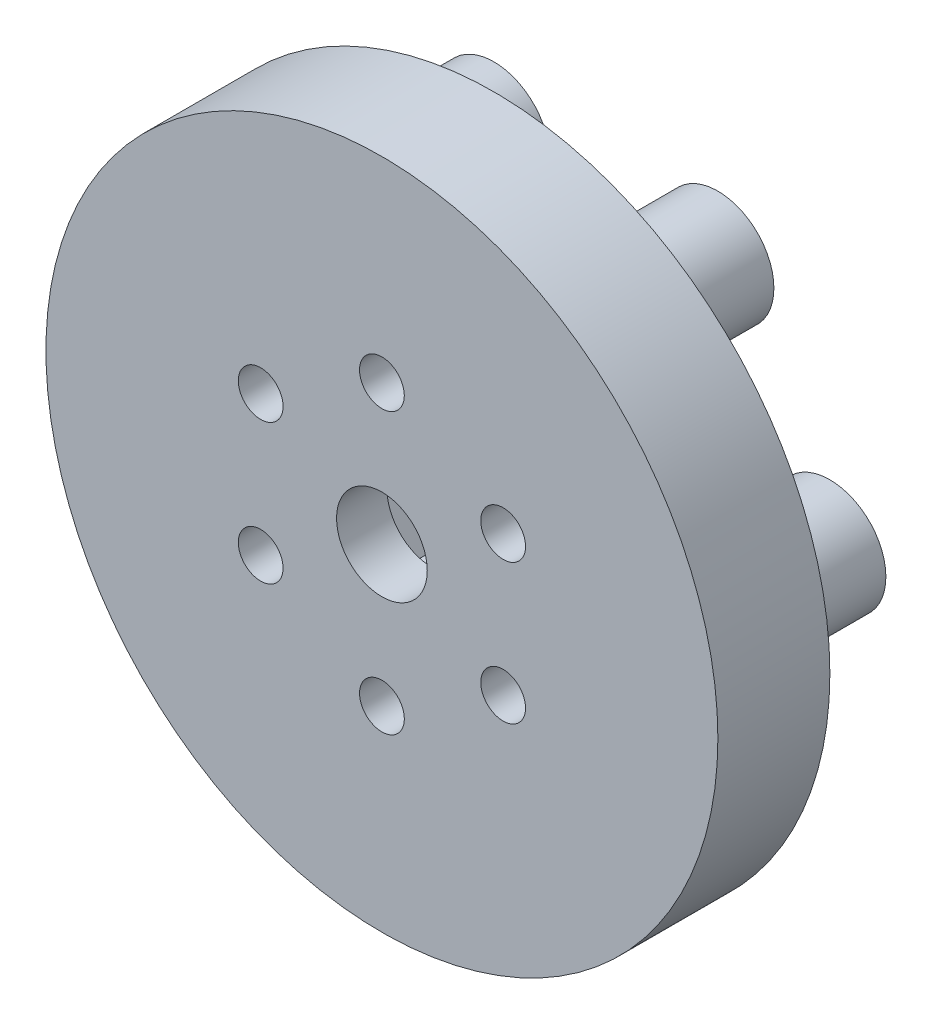
ISO-10303-21;
HEADER;
FILE_DESCRIPTION(('STEP AP214'),'2;1');
FILE_NAME('part.step','',(''),(''),'','','');
FILE_SCHEMA(('AUTOMOTIVE_DESIGN { 1 0 10303 214 1 1 1 1 }'));
ENDSEC;
DATA;
#1=APPLICATION_CONTEXT('core data for automotive mechanical design processes');
#2=APPLICATION_PROTOCOL_DEFINITION('international standard','automotive_design',2000,#1);
#3=PRODUCT_CONTEXT('',#1,'mechanical');
#4=PRODUCT('Part','Part','',(#3));
#5=PRODUCT_RELATED_PRODUCT_CATEGORY('part','',(#4));
#6=PRODUCT_DEFINITION_FORMATION('','',#4);
#7=PRODUCT_DEFINITION_CONTEXT('part definition',#1,'design');
#8=PRODUCT_DEFINITION('design','',#6,#7);
#9=PRODUCT_DEFINITION_SHAPE('','',#8);
#10=(LENGTH_UNIT() NAMED_UNIT(*) SI_UNIT(.MILLI.,.METRE.));
#11=(NAMED_UNIT(*) PLANE_ANGLE_UNIT() SI_UNIT($,.RADIAN.));
#12=(NAMED_UNIT(*) SI_UNIT($,.STERADIAN.) SOLID_ANGLE_UNIT());
#13=UNCERTAINTY_MEASURE_WITH_UNIT(LENGTH_MEASURE(1.E-05),#10,'distance_accuracy_value','');
#14=(GEOMETRIC_REPRESENTATION_CONTEXT(3) GLOBAL_UNCERTAINTY_ASSIGNED_CONTEXT((#13)) GLOBAL_UNIT_ASSIGNED_CONTEXT((#10,
#11,#12)) REPRESENTATION_CONTEXT('',''));
#15=CARTESIAN_POINT('',(0.,0.,0.));
#16=DIRECTION('',(0.,0.,1.));
#17=DIRECTION('',(1.,0.,0.));
#18=AXIS2_PLACEMENT_3D('',#15,#16,#17);
#19=CARTESIAN_POINT('',(0.,0.,20.));
#20=DIRECTION('',(0.,0.,-1.));
#21=DIRECTION('',(-1.,0.,0.));
#22=AXIS2_PLACEMENT_3D('',#19,#20,#21);
#23=CYLINDRICAL_SURFACE('',#22,4.05);
#24=CARTESIAN_POINT('',(0.,0.,20.));
#25=DIRECTION('',(0.,0.,1.));
#26=DIRECTION('',(1.,0.,0.));
#27=AXIS2_PLACEMENT_3D('',#24,#25,#26);
#28=CIRCLE('',#27,4.05);
#29=CARTESIAN_POINT('',(4.05,0.,20.));
#30=VERTEX_POINT('',#29);
#31=EDGE_CURVE('E190',#30,#30,#28,.T.);
#32=ORIENTED_EDGE('',*,*,#31,.T.);
#33=EDGE_LOOP('',(#32));
#34=FACE_BOUND('',#33,.T.);
#35=CARTESIAN_POINT('',(0.,0.,15.5));
#36=DIRECTION('',(0.,0.,-1.));
#37=DIRECTION('',(-1.,0.,0.));
#38=AXIS2_PLACEMENT_3D('',#35,#36,#37);
#39=CIRCLE('',#38,4.05);
#40=CARTESIAN_POINT('',(-4.05,0.,15.5));
#41=VERTEX_POINT('',#40);
#42=EDGE_CURVE('E37',#41,#41,#39,.T.);
#43=ORIENTED_EDGE('',*,*,#42,.T.);
#44=EDGE_LOOP('',(#43));
#45=FACE_BOUND('',#44,.T.);
#46=ADVANCED_FACE('F33',(#34,#45),#23,.F.);
#47=CARTESIAN_POINT('',(20.,0.,10.));
#48=DIRECTION('',(0.,0.,-1.));
#49=DIRECTION('',(-1.,0.,0.));
#50=AXIS2_PLACEMENT_3D('',#47,#48,#49);
#51=CYLINDRICAL_SURFACE('',#50,5.);
#52=CARTESIAN_POINT('',(20.,0.,10.));
#53=DIRECTION('',(0.,0.,1.));
#54=DIRECTION('',(1.,0.,0.));
#55=AXIS2_PLACEMENT_3D('',#52,#53,#54);
#56=CIRCLE('',#55,5.);
#57=CARTESIAN_POINT('',(25.,0.,10.));
#58=VERTEX_POINT('',#57);
#59=EDGE_CURVE('E202',#58,#58,#56,.T.);
#60=ORIENTED_EDGE('',*,*,#59,.F.);
#61=EDGE_LOOP('',(#60));
#62=FACE_BOUND('',#61,.T.);
#63=CARTESIAN_POINT('',(20.,0.,0.));
#64=DIRECTION('',(0.,0.,1.));
#65=DIRECTION('',(1.,0.,0.));
#66=AXIS2_PLACEMENT_3D('',#63,#64,#65);
#67=CIRCLE('',#66,5.);
#68=CARTESIAN_POINT('',(25.,0.,0.));
#69=VERTEX_POINT('',#68);
#70=EDGE_CURVE('E199',#69,#69,#67,.T.);
#71=ORIENTED_EDGE('',*,*,#70,.T.);
#72=EDGE_LOOP('',(#71));
#73=FACE_BOUND('',#72,.T.);
#74=ADVANCED_FACE('F35',(#62,#73),#51,.T.);
#75=CARTESIAN_POINT('',(20.,0.,0.));
#76=DIRECTION('',(0.,0.,1.));
#77=DIRECTION('',(1.,0.,0.));
#78=AXIS2_PLACEMENT_3D('',#75,#76,#77);
#79=PLANE('',#78);
#80=ORIENTED_EDGE('',*,*,#70,.F.);
#81=EDGE_LOOP('',(#80));
#82=FACE_BOUND('',#81,.T.);
#83=ADVANCED_FACE('F273',(#82),#79,.F.);
#84=CARTESIAN_POINT('',(0.,0.,20.));
#85=DIRECTION('',(0.,0.,1.));
#86=DIRECTION('',(1.,0.,0.));
#87=AXIS2_PLACEMENT_3D('',#84,#85,#86);
#88=PLANE('',#87);
#89=CARTESIAN_POINT('',(-10.8235409464711,-6.25134508762161,20.));
#90=DIRECTION('',(0.,0.,1.));
#91=DIRECTION('',(1.,0.,0.));
#92=AXIS2_PLACEMENT_3D('',#89,#90,#91);
#93=CIRCLE('',#92,2.);
#94=CARTESIAN_POINT('',(-8.82354094647114,-6.25134508762161,20.));
#95=VERTEX_POINT('',#94);
#96=EDGE_CURVE('E163',#95,#95,#93,.T.);
#97=ORIENTED_EDGE('',*,*,#96,.F.);
#98=EDGE_LOOP('',(#97));
#99=FACE_BOUND('',#98,.T.);
#100=CARTESIAN_POINT('',(10.8270941269389,-6.24865490013805,20.));
#101=DIRECTION('',(0.,0.,1.));
#102=DIRECTION('',(1.,0.,0.));
#103=AXIS2_PLACEMENT_3D('',#100,#101,#102);
#104=CIRCLE('',#103,2.);
#105=CARTESIAN_POINT('',(12.8270941269389,-6.24865490013805,20.));
#106=VERTEX_POINT('',#105);
#107=EDGE_CURVE('E175',#106,#106,#104,.T.);
#108=ORIENTED_EDGE('',*,*,#107,.F.);
#109=EDGE_LOOP('',(#108));
#110=FACE_BOUND('',#109,.T.);
#111=CARTESIAN_POINT('',(-0.000553180467794532,12.4999999877597,20.));
#112=DIRECTION('',(0.,0.,1.));
#113=DIRECTION('',(1.,0.,0.));
#114=AXIS2_PLACEMENT_3D('',#111,#112,#113);
#115=CIRCLE('',#114,2.);
#116=CARTESIAN_POINT('',(1.99944681953221,12.4999999877597,20.));
#117=VERTEX_POINT('',#116);
#118=EDGE_CURVE('E187',#117,#117,#115,.T.);
#119=ORIENTED_EDGE('',*,*,#118,.F.);
#120=EDGE_LOOP('',(#119));
#121=FACE_BOUND('',#120,.T.);
#122=CARTESIAN_POINT('',(0.,0.,20.));
#123=DIRECTION('',(0.,0.,1.));
#124=DIRECTION('',(1.,0.,0.));
#125=AXIS2_PLACEMENT_3D('',#122,#123,#124);
#126=CIRCLE('',#125,30.);
#127=CARTESIAN_POINT('',(30.,0.,20.));
#128=VERTEX_POINT('',#127);
#129=EDGE_CURVE('E196',#128,#128,#126,.T.);
#130=ORIENTED_EDGE('',*,*,#129,.T.);
#131=EDGE_LOOP('',(#130));
#132=FACE_BOUND('',#131,.T.);
#133=ORIENTED_EDGE('',*,*,#31,.F.);
#134=EDGE_LOOP('',(#133));
#135=FACE_BOUND('',#134,.T.);
#136=CARTESIAN_POINT('',(10.8255409464711,6.25134508762161,20.));
#137=DIRECTION('',(0.,0.,1.));
#138=DIRECTION('',(1.,0.,0.));
#139=AXIS2_PLACEMENT_3D('',#136,#137,#138);
#140=CIRCLE('',#139,2.);
#141=CARTESIAN_POINT('',(12.8255409464711,6.25134508762161,20.));
#142=VERTEX_POINT('',#141);
#143=EDGE_CURVE('E181',#142,#142,#140,.T.);
#144=ORIENTED_EDGE('',*,*,#143,.F.);
#145=EDGE_LOOP('',(#144));
#146=FACE_BOUND('',#145,.T.);
#147=CARTESIAN_POINT('',(0.00255318046779606,-12.4999999877597,20.));
#148=DIRECTION('',(0.,0.,1.));
#149=DIRECTION('',(1.,0.,0.));
#150=AXIS2_PLACEMENT_3D('',#147,#148,#149);
#151=CIRCLE('',#150,2.);
#152=CARTESIAN_POINT('',(2.0025531804678,-12.4999999877597,20.));
#153=VERTEX_POINT('',#152);
#154=EDGE_CURVE('E169',#153,#153,#151,.T.);
#155=ORIENTED_EDGE('',*,*,#154,.F.);
#156=EDGE_LOOP('',(#155));
#157=FACE_BOUND('',#156,.T.);
#158=CARTESIAN_POINT('',(-10.8250941269389,6.24865490013805,20.));
#159=DIRECTION('',(0.,0.,1.));
#160=DIRECTION('',(1.,0.,0.));
#161=AXIS2_PLACEMENT_3D('',#158,#159,#160);
#162=CIRCLE('',#161,2.);
#163=CARTESIAN_POINT('',(-8.82509412693894,6.24865490013805,20.));
#164=VERTEX_POINT('',#163);
#165=EDGE_CURVE('E157',#164,#164,#162,.T.);
#166=ORIENTED_EDGE('',*,*,#165,.F.);
#167=EDGE_LOOP('',(#166));
#168=FACE_BOUND('',#167,.T.);
#169=ADVANCED_FACE('F226',(#99,#110,#121,#132,#135,#146,#157,#168),#88,.T.);
#170=CARTESIAN_POINT('',(0.,0.,10.));
#171=DIRECTION('',(0.,0.,1.));
#172=DIRECTION('',(1.,0.,0.));
#173=AXIS2_PLACEMENT_3D('',#170,#171,#172);
#174=PLANE('',#173);
#175=DIRECTION('',(0.501367596211165,0.865234380656154,0.));
#176=VECTOR('',#175,1.);
#177=CARTESIAN_POINT('',(-7.62101404212473,0.0120403379396221,10.));
#178=LINE('',#177,#176);
#179=CARTESIAN_POINT('',(-7.62101404212473,0.0120403379396221,10.));
#180=VERTEX_POINT('',#179);
#181=CARTESIAN_POINT('',(-3.80007978253651,6.60601193204776,10.));
#182=VERTEX_POINT('',#181);
#183=EDGE_CURVE('E123',#180,#182,#178,.T.);
#184=ORIENTED_EDGE('',*,*,#183,.F.);
#185=DIRECTION('',(-0.498631155770342,0.866814265281285,0.));
#186=VECTOR('',#185,1.);
#187=CARTESIAN_POINT('',(-3.82093425958823,-6.59397159410814,10.));
#188=LINE('',#187,#186);
#189=CARTESIAN_POINT('',(-3.82093425958823,-6.59397159410814,10.));
#190=VERTEX_POINT('',#189);
#191=EDGE_CURVE('E49',#190,#180,#188,.T.);
#192=ORIENTED_EDGE('',*,*,#191,.F.);
#193=DIRECTION('',(-0.999998751981507,0.00157988462513009,0.));
#194=VECTOR('',#193,1.);
#195=CARTESIAN_POINT('',(3.8000797825365,-6.60601193204776,10.));
#196=LINE('',#195,#194);
#197=CARTESIAN_POINT('',(3.8000797825365,-6.60601193204776,10.));
#198=VERTEX_POINT('',#197);
#199=EDGE_CURVE('E132',#198,#190,#196,.T.);
#200=ORIENTED_EDGE('',*,*,#199,.F.);
#201=DIRECTION('',(-0.501367596211165,-0.865234380656154,0.));
#202=VECTOR('',#201,1.);
#203=CARTESIAN_POINT('',(7.62101404212473,-0.0120403379396221,10.));
#204=LINE('',#203,#202);
#205=CARTESIAN_POINT('',(7.62101404212473,-0.0120403379396221,10.));
#206=VERTEX_POINT('',#205);
#207=EDGE_CURVE('E130',#206,#198,#204,.T.);
#208=ORIENTED_EDGE('',*,*,#207,.F.);
#209=DIRECTION('',(0.498631155770342,-0.866814265281284,0.));
#210=VECTOR('',#209,1.);
#211=CARTESIAN_POINT('',(3.82093425958822,6.59397159410814,10.));
#212=LINE('',#211,#210);
#213=CARTESIAN_POINT('',(3.82093425958822,6.59397159410814,10.));
#214=VERTEX_POINT('',#213);
#215=EDGE_CURVE('E97',#214,#206,#212,.T.);
#216=ORIENTED_EDGE('',*,*,#215,.F.);
#217=DIRECTION('',(0.999998751981507,-0.00157988462513008,0.));
#218=VECTOR('',#217,1.);
#219=CARTESIAN_POINT('',(-3.80007978253651,6.60601193204776,10.));
#220=LINE('',#219,#218);
#221=EDGE_CURVE('E126',#182,#214,#220,.T.);
#222=ORIENTED_EDGE('',*,*,#221,.F.);
#223=EDGE_LOOP('',(#184,#192,#200,#208,#216,#222));
#224=FACE_BOUND('',#223,.T.);
#225=CARTESIAN_POINT('',(9.99999999999999,17.3205080756888,10.));
#226=DIRECTION('',(0.,0.,1.));
#227=DIRECTION('',(1.,0.,0.));
#228=AXIS2_PLACEMENT_3D('',#225,#226,#227);
#229=CIRCLE('',#228,5.);
#230=CARTESIAN_POINT('',(15.,17.3205080756888,10.));
#231=VERTEX_POINT('',#230);
#232=EDGE_CURVE('E11',#231,#231,#229,.F.);
#233=ORIENTED_EDGE('',*,*,#232,.F.);
#234=EDGE_LOOP('',(#233));
#235=FACE_BOUND('',#234,.T.);
#236=CARTESIAN_POINT('',(-10.,17.3205080756888,10.));
#237=DIRECTION('',(0.,0.,1.));
#238=DIRECTION('',(1.,0.,0.));
#239=AXIS2_PLACEMENT_3D('',#236,#237,#238);
#240=CIRCLE('',#239,5.);
#241=CARTESIAN_POINT('',(-5.00000000000001,17.3205080756888,10.));
#242=VERTEX_POINT('',#241);
#243=EDGE_CURVE('E42',#242,#242,#240,.F.);
#244=ORIENTED_EDGE('',*,*,#243,.F.);
#245=EDGE_LOOP('',(#244));
#246=FACE_BOUND('',#245,.T.);
#247=CARTESIAN_POINT('',(-20.,0.,10.));
#248=DIRECTION('',(0.,0.,1.));
#249=DIRECTION('',(1.,0.,0.));
#250=AXIS2_PLACEMENT_3D('',#247,#248,#249);
#251=CIRCLE('',#250,5.);
#252=CARTESIAN_POINT('',(-15.,0.,10.));
#253=VERTEX_POINT('',#252);
#254=EDGE_CURVE('E213',#253,#253,#251,.F.);
#255=ORIENTED_EDGE('',*,*,#254,.F.);
#256=EDGE_LOOP('',(#255));
#257=FACE_BOUND('',#256,.T.);
#258=CARTESIAN_POINT('',(-10.,-17.3205080756888,10.));
#259=DIRECTION('',(0.,0.,1.));
#260=DIRECTION('',(1.,0.,0.));
#261=AXIS2_PLACEMENT_3D('',#258,#259,#260);
#262=CIRCLE('',#261,5.);
#263=CARTESIAN_POINT('',(-5.,-17.3205080756888,10.));
#264=VERTEX_POINT('',#263);
#265=EDGE_CURVE('E210',#264,#264,#262,.F.);
#266=ORIENTED_EDGE('',*,*,#265,.F.);
#267=EDGE_LOOP('',(#266));
#268=FACE_BOUND('',#267,.T.);
#269=CARTESIAN_POINT('',(10.,-17.3205080756888,10.));
#270=DIRECTION('',(0.,0.,1.));
#271=DIRECTION('',(1.,0.,0.));
#272=AXIS2_PLACEMENT_3D('',#269,#270,#271);
#273=CIRCLE('',#272,5.);
#274=CARTESIAN_POINT('',(15.,-17.3205080756888,10.));
#275=VERTEX_POINT('',#274);
#276=EDGE_CURVE('E205',#275,#275,#273,.F.);
#277=ORIENTED_EDGE('',*,*,#276,.F.);
#278=EDGE_LOOP('',(#277));
#279=FACE_BOUND('',#278,.T.);
#280=ORIENTED_EDGE('',*,*,#59,.T.);
#281=EDGE_LOOP('',(#280));
#282=FACE_BOUND('',#281,.T.);
#283=CARTESIAN_POINT('',(0.,0.,10.));
#284=DIRECTION('',(0.,0.,1.));
#285=DIRECTION('',(1.,0.,0.));
#286=AXIS2_PLACEMENT_3D('',#283,#284,#285);
#287=CIRCLE('',#286,30.);
#288=CARTESIAN_POINT('',(30.,0.,10.));
#289=VERTEX_POINT('',#288);
#290=EDGE_CURVE('E195',#289,#289,#287,.T.);
#291=ORIENTED_EDGE('',*,*,#290,.F.);
#292=EDGE_LOOP('',(#291));
#293=FACE_BOUND('',#292,.T.);
#294=CARTESIAN_POINT('',(-0.000553180467794532,12.4999999877597,10.));
#295=DIRECTION('',(0.,0.,1.));
#296=DIRECTION('',(1.,0.,0.));
#297=AXIS2_PLACEMENT_3D('',#294,#295,#296);
#298=CIRCLE('',#297,2.);
#299=CARTESIAN_POINT('',(1.99944681953221,12.4999999877597,10.));
#300=VERTEX_POINT('',#299);
#301=EDGE_CURVE('E184',#300,#300,#298,.T.);
#302=ORIENTED_EDGE('',*,*,#301,.T.);
#303=EDGE_LOOP('',(#302));
#304=FACE_BOUND('',#303,.T.);
#305=CARTESIAN_POINT('',(10.8255409464711,6.25134508762161,10.));
#306=DIRECTION('',(0.,0.,1.));
#307=DIRECTION('',(1.,0.,0.));
#308=AXIS2_PLACEMENT_3D('',#305,#306,#307);
#309=CIRCLE('',#308,2.);
#310=CARTESIAN_POINT('',(12.8255409464711,6.25134508762161,10.));
#311=VERTEX_POINT('',#310);
#312=EDGE_CURVE('E178',#311,#311,#309,.T.);
#313=ORIENTED_EDGE('',*,*,#312,.T.);
#314=EDGE_LOOP('',(#313));
#315=FACE_BOUND('',#314,.T.);
#316=CARTESIAN_POINT('',(10.8270941269389,-6.24865490013805,10.));
#317=DIRECTION('',(0.,0.,1.));
#318=DIRECTION('',(1.,0.,0.));
#319=AXIS2_PLACEMENT_3D('',#316,#317,#318);
#320=CIRCLE('',#319,2.);
#321=CARTESIAN_POINT('',(12.8270941269389,-6.24865490013805,10.));
#322=VERTEX_POINT('',#321);
#323=EDGE_CURVE('E172',#322,#322,#320,.T.);
#324=ORIENTED_EDGE('',*,*,#323,.T.);
#325=EDGE_LOOP('',(#324));
#326=FACE_BOUND('',#325,.T.);
#327=CARTESIAN_POINT('',(0.00255318046779606,-12.4999999877597,10.));
#328=DIRECTION('',(0.,0.,1.));
#329=DIRECTION('',(1.,0.,0.));
#330=AXIS2_PLACEMENT_3D('',#327,#328,#329);
#331=CIRCLE('',#330,2.);
#332=CARTESIAN_POINT('',(2.0025531804678,-12.4999999877597,10.));
#333=VERTEX_POINT('',#332);
#334=EDGE_CURVE('E166',#333,#333,#331,.T.);
#335=ORIENTED_EDGE('',*,*,#334,.T.);
#336=EDGE_LOOP('',(#335));
#337=FACE_BOUND('',#336,.T.);
#338=CARTESIAN_POINT('',(-10.8235409464711,-6.25134508762161,10.));
#339=DIRECTION('',(0.,0.,1.));
#340=DIRECTION('',(1.,0.,0.));
#341=AXIS2_PLACEMENT_3D('',#338,#339,#340);
#342=CIRCLE('',#341,2.);
#343=CARTESIAN_POINT('',(-8.82354094647114,-6.25134508762161,10.));
#344=VERTEX_POINT('',#343);
#345=EDGE_CURVE('E160',#344,#344,#342,.T.);
#346=ORIENTED_EDGE('',*,*,#345,.T.);
#347=EDGE_LOOP('',(#346));
#348=FACE_BOUND('',#347,.T.);
#349=CARTESIAN_POINT('',(-10.8250941269389,6.24865490013805,10.));
#350=DIRECTION('',(0.,0.,1.));
#351=DIRECTION('',(1.,0.,0.));
#352=AXIS2_PLACEMENT_3D('',#349,#350,#351);
#353=CIRCLE('',#352,2.);
#354=CARTESIAN_POINT('',(-8.82509412693894,6.24865490013805,10.));
#355=VERTEX_POINT('',#354);
#356=EDGE_CURVE('E156',#355,#355,#353,.T.);
#357=ORIENTED_EDGE('',*,*,#356,.T.);
#358=EDGE_LOOP('',(#357));
#359=FACE_BOUND('',#358,.T.);
#360=ADVANCED_FACE('F222',(#224,#235,#246,#257,#268,#279,#282,#293,#304,#315,#326,#337,#348,
#359),#174,.F.);
#361=CARTESIAN_POINT('',(0.,0.,20.));
#362=DIRECTION('',(0.,0.,-1.));
#363=DIRECTION('',(-1.,0.,0.));
#364=AXIS2_PLACEMENT_3D('',#361,#362,#363);
#365=CYLINDRICAL_SURFACE('',#364,30.);
#366=ORIENTED_EDGE('',*,*,#129,.F.);
#367=EDGE_LOOP('',(#366));
#368=FACE_BOUND('',#367,.T.);
#369=ORIENTED_EDGE('',*,*,#290,.T.);
#370=EDGE_LOOP('',(#369));
#371=FACE_BOUND('',#370,.T.);
#372=ADVANCED_FACE('F225',(#368,#371),#365,.T.);
#373=CARTESIAN_POINT('',(-0.000553180467794532,12.4999999877597,20.));
#374=DIRECTION('',(0.,0.,-1.));
#375=DIRECTION('',(-1.,0.,0.));
#376=AXIS2_PLACEMENT_3D('',#373,#374,#375);
#377=CYLINDRICAL_SURFACE('',#376,2.);
#378=ORIENTED_EDGE('',*,*,#118,.T.);
#379=EDGE_LOOP('',(#378));
#380=FACE_BOUND('',#379,.T.);
#381=ORIENTED_EDGE('',*,*,#301,.F.);
#382=EDGE_LOOP('',(#381));
#383=FACE_BOUND('',#382,.T.);
#384=ADVANCED_FACE('F278',(#380,#383),#377,.F.);
#385=CARTESIAN_POINT('',(10.8255409464711,6.25134508762161,20.));
#386=DIRECTION('',(0.,0.,-1.));
#387=DIRECTION('',(-1.,0.,0.));
#388=AXIS2_PLACEMENT_3D('',#385,#386,#387);
#389=CYLINDRICAL_SURFACE('',#388,2.);
#390=ORIENTED_EDGE('',*,*,#143,.T.);
#391=EDGE_LOOP('',(#390));
#392=FACE_BOUND('',#391,.T.);
#393=ORIENTED_EDGE('',*,*,#312,.F.);
#394=EDGE_LOOP('',(#393));
#395=FACE_BOUND('',#394,.T.);
#396=ADVANCED_FACE('F312',(#392,#395),#389,.F.);
#397=CARTESIAN_POINT('',(10.8270941269389,-6.24865490013805,20.));
#398=DIRECTION('',(0.,0.,-1.));
#399=DIRECTION('',(-1.,0.,0.));
#400=AXIS2_PLACEMENT_3D('',#397,#398,#399);
#401=CYLINDRICAL_SURFACE('',#400,2.);
#402=ORIENTED_EDGE('',*,*,#107,.T.);
#403=EDGE_LOOP('',(#402));
#404=FACE_BOUND('',#403,.T.);
#405=ORIENTED_EDGE('',*,*,#323,.F.);
#406=EDGE_LOOP('',(#405));
#407=FACE_BOUND('',#406,.T.);
#408=ADVANCED_FACE('F319',(#404,#407),#401,.F.);
#409=CARTESIAN_POINT('',(0.00255318046779606,-12.4999999877597,20.));
#410=DIRECTION('',(0.,0.,-1.));
#411=DIRECTION('',(-1.,0.,0.));
#412=AXIS2_PLACEMENT_3D('',#409,#410,#411);
#413=CYLINDRICAL_SURFACE('',#412,2.);
#414=ORIENTED_EDGE('',*,*,#154,.T.);
#415=EDGE_LOOP('',(#414));
#416=FACE_BOUND('',#415,.T.);
#417=ORIENTED_EDGE('',*,*,#334,.F.);
#418=EDGE_LOOP('',(#417));
#419=FACE_BOUND('',#418,.T.);
#420=ADVANCED_FACE('F264',(#416,#419),#413,.F.);
#421=CARTESIAN_POINT('',(-10.8235409464711,-6.25134508762161,20.));
#422=DIRECTION('',(0.,0.,-1.));
#423=DIRECTION('',(-1.,0.,0.));
#424=AXIS2_PLACEMENT_3D('',#421,#422,#423);
#425=CYLINDRICAL_SURFACE('',#424,2.);
#426=ORIENTED_EDGE('',*,*,#96,.T.);
#427=EDGE_LOOP('',(#426));
#428=FACE_BOUND('',#427,.T.);
#429=ORIENTED_EDGE('',*,*,#345,.F.);
#430=EDGE_LOOP('',(#429));
#431=FACE_BOUND('',#430,.T.);
#432=ADVANCED_FACE('F254',(#428,#431),#425,.F.);
#433=CARTESIAN_POINT('',(-10.8250941269389,6.24865490013805,20.));
#434=DIRECTION('',(0.,0.,-1.));
#435=DIRECTION('',(-1.,0.,0.));
#436=AXIS2_PLACEMENT_3D('',#433,#434,#435);
#437=CYLINDRICAL_SURFACE('',#436,2.);
#438=ORIENTED_EDGE('',*,*,#165,.T.);
#439=EDGE_LOOP('',(#438));
#440=FACE_BOUND('',#439,.T.);
#441=ORIENTED_EDGE('',*,*,#356,.F.);
#442=EDGE_LOOP('',(#441));
#443=FACE_BOUND('',#442,.T.);
#444=ADVANCED_FACE('F251',(#440,#443),#437,.F.);
#445=CARTESIAN_POINT('',(10.,-17.3205080756888,10.));
#446=DIRECTION('',(0.,0.,-1.));
#447=DIRECTION('',(-1.,0.,0.));
#448=AXIS2_PLACEMENT_3D('',#445,#446,#447);
#449=CYLINDRICAL_SURFACE('',#448,5.);
#450=ORIENTED_EDGE('',*,*,#276,.T.);
#451=EDGE_LOOP('',(#450));
#452=FACE_BOUND('',#451,.T.);
#453=CARTESIAN_POINT('',(10.,-17.3205080756888,0.));
#454=DIRECTION('',(0.,0.,1.));
#455=DIRECTION('',(1.,0.,0.));
#456=AXIS2_PLACEMENT_3D('',#453,#454,#455);
#457=CIRCLE('',#456,5.);
#458=CARTESIAN_POINT('',(15.,-17.3205080756888,0.));
#459=VERTEX_POINT('',#458);
#460=EDGE_CURVE('E153',#459,#459,#457,.T.);
#461=ORIENTED_EDGE('',*,*,#460,.T.);
#462=EDGE_LOOP('',(#461));
#463=FACE_BOUND('',#462,.T.);
#464=ADVANCED_FACE('F253',(#452,#463),#449,.T.);
#465=CARTESIAN_POINT('',(10.,-17.3205080756888,0.));
#466=DIRECTION('',(0.,0.,1.));
#467=DIRECTION('',(1.,0.,0.));
#468=AXIS2_PLACEMENT_3D('',#465,#466,#467);
#469=PLANE('',#468);
#470=ORIENTED_EDGE('',*,*,#460,.F.);
#471=EDGE_LOOP('',(#470));
#472=FACE_BOUND('',#471,.T.);
#473=ADVANCED_FACE('F261',(#472),#469,.F.);
#474=CARTESIAN_POINT('',(-10.,-17.3205080756888,10.));
#475=DIRECTION('',(0.,0.,-1.));
#476=DIRECTION('',(-1.,0.,0.));
#477=AXIS2_PLACEMENT_3D('',#474,#475,#476);
#478=CYLINDRICAL_SURFACE('',#477,5.);
#479=ORIENTED_EDGE('',*,*,#265,.T.);
#480=EDGE_LOOP('',(#479));
#481=FACE_BOUND('',#480,.T.);
#482=CARTESIAN_POINT('',(-10.,-17.3205080756888,0.));
#483=DIRECTION('',(0.,0.,1.));
#484=DIRECTION('',(1.,0.,0.));
#485=AXIS2_PLACEMENT_3D('',#482,#483,#484);
#486=CIRCLE('',#485,5.);
#487=CARTESIAN_POINT('',(-5.,-17.3205080756888,0.));
#488=VERTEX_POINT('',#487);
#489=EDGE_CURVE('E150',#488,#488,#486,.T.);
#490=ORIENTED_EDGE('',*,*,#489,.T.);
#491=EDGE_LOOP('',(#490));
#492=FACE_BOUND('',#491,.T.);
#493=ADVANCED_FACE('F358',(#481,#492),#478,.T.);
#494=CARTESIAN_POINT('',(-10.,-17.3205080756888,0.));
#495=DIRECTION('',(0.,0.,1.));
#496=DIRECTION('',(1.,0.,0.));
#497=AXIS2_PLACEMENT_3D('',#494,#495,#496);
#498=PLANE('',#497);
#499=ORIENTED_EDGE('',*,*,#489,.F.);
#500=EDGE_LOOP('',(#499));
#501=FACE_BOUND('',#500,.T.);
#502=ADVANCED_FACE('F368',(#501),#498,.F.);
#503=CARTESIAN_POINT('',(-20.,0.,10.));
#504=DIRECTION('',(0.,0.,-1.));
#505=DIRECTION('',(-1.,0.,0.));
#506=AXIS2_PLACEMENT_3D('',#503,#504,#505);
#507=CYLINDRICAL_SURFACE('',#506,5.);
#508=ORIENTED_EDGE('',*,*,#254,.T.);
#509=EDGE_LOOP('',(#508));
#510=FACE_BOUND('',#509,.T.);
#511=CARTESIAN_POINT('',(-20.,0.,0.));
#512=DIRECTION('',(0.,0.,1.));
#513=DIRECTION('',(1.,0.,0.));
#514=AXIS2_PLACEMENT_3D('',#511,#512,#513);
#515=CIRCLE('',#514,5.);
#516=CARTESIAN_POINT('',(-15.,0.,0.));
#517=VERTEX_POINT('',#516);
#518=EDGE_CURVE('E147',#517,#517,#515,.T.);
#519=ORIENTED_EDGE('',*,*,#518,.T.);
#520=EDGE_LOOP('',(#519));
#521=FACE_BOUND('',#520,.T.);
#522=ADVANCED_FACE('F378',(#510,#521),#507,.T.);
#523=CARTESIAN_POINT('',(-20.,0.,0.));
#524=DIRECTION('',(0.,0.,1.));
#525=DIRECTION('',(1.,0.,0.));
#526=AXIS2_PLACEMENT_3D('',#523,#524,#525);
#527=PLANE('',#526);
#528=ORIENTED_EDGE('',*,*,#518,.F.);
#529=EDGE_LOOP('',(#528));
#530=FACE_BOUND('',#529,.T.);
#531=ADVANCED_FACE('F388',(#530),#527,.F.);
#532=CARTESIAN_POINT('',(-10.,17.3205080756888,10.));
#533=DIRECTION('',(0.,0.,-1.));
#534=DIRECTION('',(-1.,0.,0.));
#535=AXIS2_PLACEMENT_3D('',#532,#533,#534);
#536=CYLINDRICAL_SURFACE('',#535,5.);
#537=ORIENTED_EDGE('',*,*,#243,.T.);
#538=EDGE_LOOP('',(#537));
#539=FACE_BOUND('',#538,.T.);
#540=CARTESIAN_POINT('',(-10.,17.3205080756888,0.));
#541=DIRECTION('',(0.,0.,1.));
#542=DIRECTION('',(1.,0.,0.));
#543=AXIS2_PLACEMENT_3D('',#540,#541,#542);
#544=CIRCLE('',#543,5.);
#545=CARTESIAN_POINT('',(-5.00000000000001,17.3205080756888,0.));
#546=VERTEX_POINT('',#545);
#547=EDGE_CURVE('E144',#546,#546,#544,.T.);
#548=ORIENTED_EDGE('',*,*,#547,.T.);
#549=EDGE_LOOP('',(#548));
#550=FACE_BOUND('',#549,.T.);
#551=ADVANCED_FACE('F219',(#539,#550),#536,.T.);
#552=CARTESIAN_POINT('',(-10.,17.3205080756888,0.));
#553=DIRECTION('',(0.,0.,1.));
#554=DIRECTION('',(1.,0.,0.));
#555=AXIS2_PLACEMENT_3D('',#552,#553,#554);
#556=PLANE('',#555);
#557=ORIENTED_EDGE('',*,*,#547,.F.);
#558=EDGE_LOOP('',(#557));
#559=FACE_BOUND('',#558,.T.);
#560=ADVANCED_FACE('F407',(#559),#556,.F.);
#561=CARTESIAN_POINT('',(9.99999999999999,17.3205080756888,10.));
#562=DIRECTION('',(0.,0.,-1.));
#563=DIRECTION('',(-1.,0.,0.));
#564=AXIS2_PLACEMENT_3D('',#561,#562,#563);
#565=CYLINDRICAL_SURFACE('',#564,5.);
#566=ORIENTED_EDGE('',*,*,#232,.T.);
#567=EDGE_LOOP('',(#566));
#568=FACE_BOUND('',#567,.T.);
#569=CARTESIAN_POINT('',(9.99999999999999,17.3205080756888,0.));
#570=DIRECTION('',(0.,0.,1.));
#571=DIRECTION('',(1.,0.,0.));
#572=AXIS2_PLACEMENT_3D('',#569,#570,#571);
#573=CIRCLE('',#572,5.);
#574=CARTESIAN_POINT('',(15.,17.3205080756888,0.));
#575=VERTEX_POINT('',#574);
#576=EDGE_CURVE('E141',#575,#575,#573,.T.);
#577=ORIENTED_EDGE('',*,*,#576,.T.);
#578=EDGE_LOOP('',(#577));
#579=FACE_BOUND('',#578,.T.);
#580=ADVANCED_FACE('F416',(#568,#579),#565,.T.);
#581=CARTESIAN_POINT('',(9.99999999999999,17.3205080756888,0.));
#582=DIRECTION('',(0.,0.,1.));
#583=DIRECTION('',(1.,0.,0.));
#584=AXIS2_PLACEMENT_3D('',#581,#582,#583);
#585=PLANE('',#584);
#586=ORIENTED_EDGE('',*,*,#576,.F.);
#587=EDGE_LOOP('',(#586));
#588=FACE_BOUND('',#587,.T.);
#589=ADVANCED_FACE('F426',(#588),#585,.F.);
#590=CARTESIAN_POINT('',(-3.82093425958823,-6.59397159410814,15.5));
#591=DIRECTION('',(-0.866814265281285,-0.498631155770342,0.));
#592=DIRECTION('',(0.498631155770342,-0.866814265281285,0.));
#593=AXIS2_PLACEMENT_3D('',#590,#591,#592);
#594=PLANE('',#593);
#595=ORIENTED_EDGE('',*,*,#191,.T.);
#596=DIRECTION('',(0.,0.,-1.));
#597=VECTOR('',#596,1.);
#598=CARTESIAN_POINT('',(-7.62101404212473,0.0120403379396221,15.5));
#599=LINE('',#598,#597);
#600=CARTESIAN_POINT('',(-7.62101404212473,0.0120403379396221,15.5));
#601=VERTEX_POINT('',#600);
#602=EDGE_CURVE('E79',#601,#180,#599,.T.);
#603=ORIENTED_EDGE('',*,*,#602,.F.);
#604=DIRECTION('',(-0.498631155770342,0.866814265281285,0.));
#605=VECTOR('',#604,1.);
#606=CARTESIAN_POINT('',(-3.82093425958823,-6.59397159410814,15.5));
#607=LINE('',#606,#605);
#608=CARTESIAN_POINT('',(-3.82093425958823,-6.59397159410814,15.5));
#609=VERTEX_POINT('',#608);
#610=EDGE_CURVE('E134',#609,#601,#607,.T.);
#611=ORIENTED_EDGE('',*,*,#610,.F.);
#612=DIRECTION('',(0.,0.,-1.));
#613=VECTOR('',#612,1.);
#614=CARTESIAN_POINT('',(-3.82093425958823,-6.59397159410814,15.5));
#615=LINE('',#614,#613);
#616=EDGE_CURVE('E57',#609,#190,#615,.T.);
#617=ORIENTED_EDGE('',*,*,#616,.T.);
#618=EDGE_LOOP('',(#595,#603,#611,#617));
#619=FACE_BOUND('',#618,.T.);
#620=ADVANCED_FACE('F435',(#619),#594,.F.);
#621=CARTESIAN_POINT('',(3.8000797825365,-6.60601193204776,15.5));
#622=DIRECTION('',(-0.00157988462513008,-0.999998751981507,0.));
#623=DIRECTION('',(0.999998751981507,-0.00157988462513008,0.));
#624=AXIS2_PLACEMENT_3D('',#621,#622,#623);
#625=PLANE('',#624);
#626=ORIENTED_EDGE('',*,*,#199,.T.);
#627=ORIENTED_EDGE('',*,*,#616,.F.);
#628=DIRECTION('',(-0.999998751981507,0.00157988462513009,0.));
#629=VECTOR('',#628,1.);
#630=CARTESIAN_POINT('',(3.8000797825365,-6.60601193204776,15.5));
#631=LINE('',#630,#629);
#632=CARTESIAN_POINT('',(3.8000797825365,-6.60601193204776,15.5));
#633=VERTEX_POINT('',#632);
#634=EDGE_CURVE('E109',#633,#609,#631,.T.);
#635=ORIENTED_EDGE('',*,*,#634,.F.);
#636=DIRECTION('',(0.,0.,-1.));
#637=VECTOR('',#636,1.);
#638=CARTESIAN_POINT('',(3.8000797825365,-6.60601193204776,15.5));
#639=LINE('',#638,#637);
#640=EDGE_CURVE('E101',#633,#198,#639,.T.);
#641=ORIENTED_EDGE('',*,*,#640,.T.);
#642=EDGE_LOOP('',(#626,#627,#635,#641));
#643=FACE_BOUND('',#642,.T.);
#644=ADVANCED_FACE('F449',(#643),#625,.F.);
#645=CARTESIAN_POINT('',(7.62101404212473,-0.0120403379396221,15.5));
#646=DIRECTION('',(0.865234380656154,-0.501367596211165,0.));
#647=DIRECTION('',(0.501367596211165,0.865234380656154,0.));
#648=AXIS2_PLACEMENT_3D('',#645,#646,#647);
#649=PLANE('',#648);
#650=ORIENTED_EDGE('',*,*,#207,.T.);
#651=ORIENTED_EDGE('',*,*,#640,.F.);
#652=DIRECTION('',(-0.501367596211165,-0.865234380656154,0.));
#653=VECTOR('',#652,1.);
#654=CARTESIAN_POINT('',(7.62101404212473,-0.0120403379396221,15.5));
#655=LINE('',#654,#653);
#656=CARTESIAN_POINT('',(7.62101404212473,-0.0120403379396221,15.5));
#657=VERTEX_POINT('',#656);
#658=EDGE_CURVE('E105',#657,#633,#655,.T.);
#659=ORIENTED_EDGE('',*,*,#658,.F.);
#660=DIRECTION('',(0.,0.,-1.));
#661=VECTOR('',#660,1.);
#662=CARTESIAN_POINT('',(7.62101404212473,-0.0120403379396221,15.5));
#663=LINE('',#662,#661);
#664=EDGE_CURVE('E90',#657,#206,#663,.T.);
#665=ORIENTED_EDGE('',*,*,#664,.T.);
#666=EDGE_LOOP('',(#650,#651,#659,#665));
#667=FACE_BOUND('',#666,.T.);
#668=ADVANCED_FACE('F106',(#667),#649,.F.);
#669=CARTESIAN_POINT('',(3.82093425958822,6.59397159410814,15.5));
#670=DIRECTION('',(0.866814265281284,0.498631155770342,0.));
#671=DIRECTION('',(-0.498631155770342,0.866814265281284,0.));
#672=AXIS2_PLACEMENT_3D('',#669,#670,#671);
#673=PLANE('',#672);
#674=ORIENTED_EDGE('',*,*,#215,.T.);
#675=ORIENTED_EDGE('',*,*,#664,.F.);
#676=DIRECTION('',(0.498631155770342,-0.866814265281284,0.));
#677=VECTOR('',#676,1.);
#678=CARTESIAN_POINT('',(3.82093425958822,6.59397159410814,15.5));
#679=LINE('',#678,#677);
#680=CARTESIAN_POINT('',(3.82093425958822,6.59397159410814,15.5));
#681=VERTEX_POINT('',#680);
#682=EDGE_CURVE('E94',#681,#657,#679,.T.);
#683=ORIENTED_EDGE('',*,*,#682,.F.);
#684=DIRECTION('',(0.,0.,-1.));
#685=VECTOR('',#684,1.);
#686=CARTESIAN_POINT('',(3.82093425958822,6.59397159410814,15.5));
#687=LINE('',#686,#685);
#688=EDGE_CURVE('E102',#681,#214,#687,.T.);
#689=ORIENTED_EDGE('',*,*,#688,.T.);
#690=EDGE_LOOP('',(#674,#675,#683,#689));
#691=FACE_BOUND('',#690,.T.);
#692=ADVANCED_FACE('F92',(#691),#673,.F.);
#693=CARTESIAN_POINT('',(-3.80007978253651,6.60601193204776,15.5));
#694=DIRECTION('',(0.00157988462513008,0.999998751981507,0.));
#695=DIRECTION('',(-0.999998751981507,0.00157988462513008,0.));
#696=AXIS2_PLACEMENT_3D('',#693,#694,#695);
#697=PLANE('',#696);
#698=ORIENTED_EDGE('',*,*,#221,.T.);
#699=ORIENTED_EDGE('',*,*,#688,.F.);
#700=DIRECTION('',(0.999998751981507,-0.00157988462513008,0.));
#701=VECTOR('',#700,1.);
#702=CARTESIAN_POINT('',(-3.80007978253651,6.60601193204776,15.5));
#703=LINE('',#702,#701);
#704=CARTESIAN_POINT('',(-3.80007978253651,6.60601193204776,15.5));
#705=VERTEX_POINT('',#704);
#706=EDGE_CURVE('E115',#705,#681,#703,.T.);
#707=ORIENTED_EDGE('',*,*,#706,.F.);
#708=DIRECTION('',(0.,0.,-1.));
#709=VECTOR('',#708,1.);
#710=CARTESIAN_POINT('',(-3.80007978253651,6.60601193204776,15.5));
#711=LINE('',#710,#709);
#712=EDGE_CURVE('E138',#705,#182,#711,.T.);
#713=ORIENTED_EDGE('',*,*,#712,.T.);
#714=EDGE_LOOP('',(#698,#699,#707,#713));
#715=FACE_BOUND('',#714,.T.);
#716=ADVANCED_FACE('F471',(#715),#697,.F.);
#717=CARTESIAN_POINT('',(-7.62101404212473,0.0120403379396221,15.5));
#718=DIRECTION('',(-0.865234380656154,0.501367596211165,0.));
#719=DIRECTION('',(-0.501367596211165,-0.865234380656154,0.));
#720=AXIS2_PLACEMENT_3D('',#717,#718,#719);
#721=PLANE('',#720);
#722=ORIENTED_EDGE('',*,*,#183,.T.);
#723=ORIENTED_EDGE('',*,*,#712,.F.);
#724=DIRECTION('',(0.501367596211165,0.865234380656154,0.));
#725=VECTOR('',#724,1.);
#726=CARTESIAN_POINT('',(-7.62101404212473,0.0120403379396221,15.5));
#727=LINE('',#726,#725);
#728=EDGE_CURVE('E117',#601,#705,#727,.T.);
#729=ORIENTED_EDGE('',*,*,#728,.F.);
#730=ORIENTED_EDGE('',*,*,#602,.T.);
#731=EDGE_LOOP('',(#722,#723,#729,#730));
#732=FACE_BOUND('',#731,.T.);
#733=ADVANCED_FACE('F479',(#732),#721,.F.);
#734=CARTESIAN_POINT('',(0.,0.,15.5));
#735=DIRECTION('',(0.,0.,-1.));
#736=DIRECTION('',(-1.,0.,0.));
#737=AXIS2_PLACEMENT_3D('',#734,#735,#736);
#738=PLANE('',#737);
#739=ORIENTED_EDGE('',*,*,#42,.F.);
#740=EDGE_LOOP('',(#739));
#741=FACE_BOUND('',#740,.T.);
#742=ORIENTED_EDGE('',*,*,#610,.T.);
#743=ORIENTED_EDGE('',*,*,#728,.T.);
#744=ORIENTED_EDGE('',*,*,#706,.T.);
#745=ORIENTED_EDGE('',*,*,#682,.T.);
#746=ORIENTED_EDGE('',*,*,#658,.T.);
#747=ORIENTED_EDGE('',*,*,#634,.T.);
#748=EDGE_LOOP('',(#742,#743,#744,#745,#746,#747));
#749=FACE_BOUND('',#748,.T.);
#750=ADVANCED_FACE('F112',(#741,#749),#738,.T.);
#751=CLOSED_SHELL('',(#46,#74,#83,#169,#360,#372,#384,#396,#408,#420,#432,#444,#464,#473,#493,
#502,#522,#531,#551,#560,#580,#589,#620,#644,#668,#692,#716,#733,#750));
#752=MANIFOLD_SOLID_BREP('B2',#751);
#753=ADVANCED_BREP_SHAPE_REPRESENTATION('',(#18,#752),#14);
#754=SHAPE_DEFINITION_REPRESENTATION(#9,#753);
ENDSEC;
END-ISO-10303-21;
